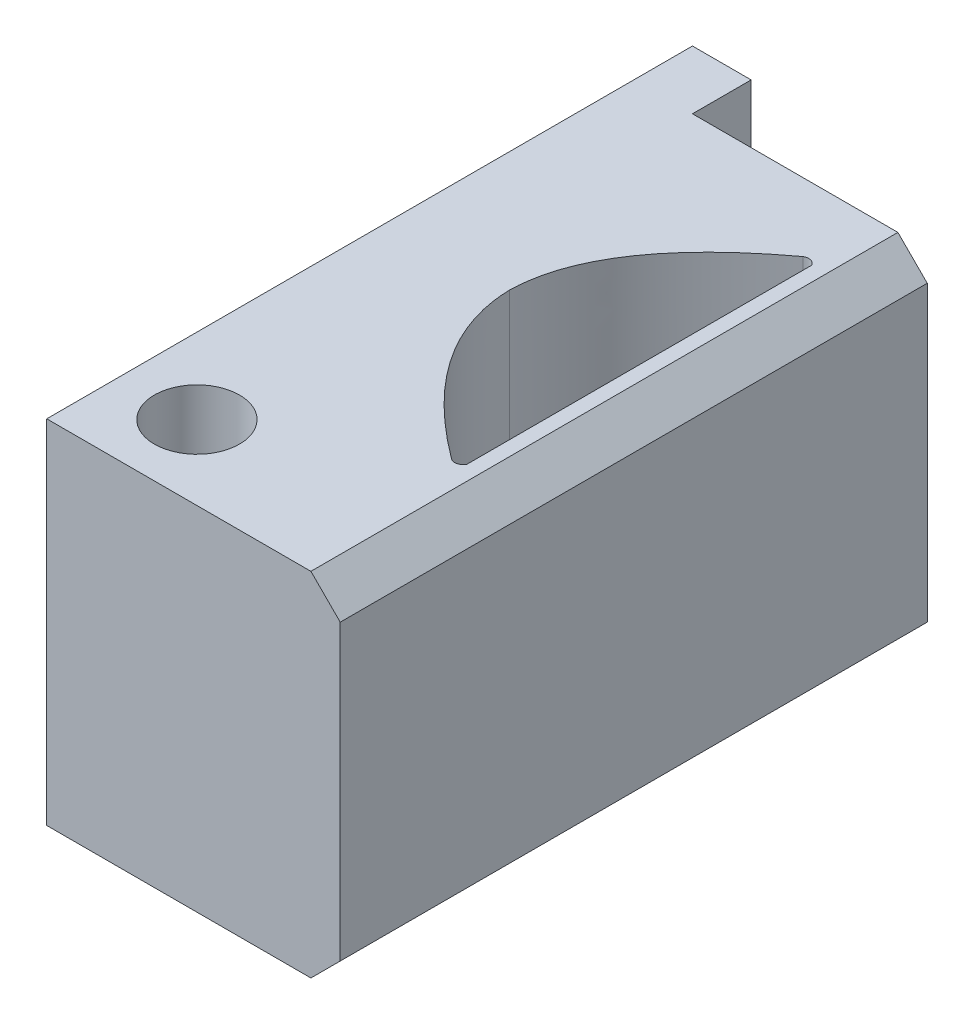
ISO-10303-21;
HEADER;
FILE_DESCRIPTION(('STEP AP214'),'2;1');
FILE_NAME('part.step','',(''),(''),'','','');
FILE_SCHEMA(('AUTOMOTIVE_DESIGN { 1 0 10303 214 1 1 1 1 }'));
ENDSEC;
DATA;
#1=APPLICATION_CONTEXT('core data for automotive mechanical design processes');
#2=APPLICATION_PROTOCOL_DEFINITION('international standard','automotive_design',2000,#1);
#3=PRODUCT_CONTEXT('',#1,'mechanical');
#4=PRODUCT('Part','Part','',(#3));
#5=PRODUCT_RELATED_PRODUCT_CATEGORY('part','',(#4));
#6=PRODUCT_DEFINITION_FORMATION('','',#4);
#7=PRODUCT_DEFINITION_CONTEXT('part definition',#1,'design');
#8=PRODUCT_DEFINITION('design','',#6,#7);
#9=PRODUCT_DEFINITION_SHAPE('','',#8);
#10=(LENGTH_UNIT() NAMED_UNIT(*) SI_UNIT(.MILLI.,.METRE.));
#11=(NAMED_UNIT(*) PLANE_ANGLE_UNIT() SI_UNIT($,.RADIAN.));
#12=(NAMED_UNIT(*) SI_UNIT($,.STERADIAN.) SOLID_ANGLE_UNIT());
#13=UNCERTAINTY_MEASURE_WITH_UNIT(LENGTH_MEASURE(1.E-05),#10,'distance_accuracy_value','');
#14=(GEOMETRIC_REPRESENTATION_CONTEXT(3) GLOBAL_UNCERTAINTY_ASSIGNED_CONTEXT((#13)) GLOBAL_UNIT_ASSIGNED_CONTEXT((#10,
#11,#12)) REPRESENTATION_CONTEXT('',''));
#15=CARTESIAN_POINT('',(0.,0.,0.));
#16=DIRECTION('',(0.,0.,1.));
#17=DIRECTION('',(1.,0.,0.));
#18=AXIS2_PLACEMENT_3D('',#15,#16,#17);
#19=CARTESIAN_POINT('',(-14.7422680412371,34.3606797749979,-11.9587628865979));
#20=DIRECTION('',(0.,0.,1.));
#21=DIRECTION('',(1.,0.,0.));
#22=AXIS2_PLACEMENT_3D('',#19,#20,#21);
#23=PLANE('',#22);
#24=DIRECTION('',(0.,-1.,0.));
#25=VECTOR('',#24,1.);
#26=CARTESIAN_POINT('',(-4.74226804123712,34.3606797749979,-11.9587628865979));
#27=LINE('',#26,#25);
#28=CARTESIAN_POINT('',(-4.74226804123712,11.,-11.9587628865979));
#29=VERTEX_POINT('',#28);
#30=CARTESIAN_POINT('',(-4.74226804123712,0.999999999999994,-11.9587628865979));
#31=VERTEX_POINT('',#30);
#32=EDGE_CURVE('E301',#29,#31,#27,.T.);
#33=ORIENTED_EDGE('',*,*,#32,.T.);
#34=DIRECTION('',(0.70710678118655,0.707106781186545,0.));
#35=VECTOR('',#34,1.);
#36=CARTESIAN_POINT('',(-4.74226804123712,0.999999999999994,-11.9587628865979));
#37=LINE('',#36,#35);
#38=CARTESIAN_POINT('',(-5.74226804123712,0.,-11.9587628865979));
#39=VERTEX_POINT('',#38);
#40=EDGE_CURVE('E262',#31,#39,#37,.F.);
#41=ORIENTED_EDGE('',*,*,#40,.T.);
#42=DIRECTION('',(-1.,0.,0.));
#43=VECTOR('',#42,1.);
#44=CARTESIAN_POINT('',(-14.7422680412371,0.,-11.9587628865979));
#45=LINE('',#44,#43);
#46=CARTESIAN_POINT('',(-12.7422680412371,0.,-11.9587628865979));
#47=VERTEX_POINT('',#46);
#48=EDGE_CURVE('E305',#39,#47,#45,.T.);
#49=ORIENTED_EDGE('',*,*,#48,.T.);
#50=DIRECTION('',(0.,-1.,0.));
#51=VECTOR('',#50,1.);
#52=CARTESIAN_POINT('',(-12.7422680412371,0.,-11.9587628865979));
#53=LINE('',#52,#51);
#54=CARTESIAN_POINT('',(-12.7422680412371,12.,-11.9587628865979));
#55=VERTEX_POINT('',#54);
#56=EDGE_CURVE('E170',#55,#47,#53,.T.);
#57=ORIENTED_EDGE('',*,*,#56,.F.);
#58=DIRECTION('',(-1.,0.,0.));
#59=VECTOR('',#58,1.);
#60=CARTESIAN_POINT('',(-14.7422680412371,12.,-11.9587628865979));
#61=LINE('',#60,#59);
#62=CARTESIAN_POINT('',(-5.74226804123712,12.,-11.9587628865979));
#63=VERTEX_POINT('',#62);
#64=EDGE_CURVE('E153',#63,#55,#61,.T.);
#65=ORIENTED_EDGE('',*,*,#64,.F.);
#66=DIRECTION('',(0.707106781186547,-0.707106781186548,0.));
#67=VECTOR('',#66,1.);
#68=CARTESIAN_POINT('',(-5.74226804123712,12.,-11.9587628865979));
#69=LINE('',#68,#67);
#70=EDGE_CURVE('E265',#63,#29,#69,.T.);
#71=ORIENTED_EDGE('',*,*,#70,.T.);
#72=EDGE_LOOP('',(#33,#41,#49,#57,#65,#71));
#73=FACE_BOUND('',#72,.T.);
#74=ADVANCED_FACE('F42',(#73),#23,.F.);
#75=CARTESIAN_POINT('',(-14.7422680412371,34.3606797749979,-11.9587628865979));
#76=DIRECTION('',(1.,0.,0.));
#77=DIRECTION('',(0.,0.,-1.));
#78=AXIS2_PLACEMENT_3D('',#75,#76,#77);
#79=PLANE('',#78);
#80=CARTESIAN_POINT('',(-14.7422680412371,6.,-6.91638582065934));
#81=DIRECTION('',(-1.,0.,0.));
#82=DIRECTION('',(0.,0.,1.));
#83=AXIS2_PLACEMENT_3D('',#80,#81,#82);
#84=CIRCLE('',#83,4.);
#85=CARTESIAN_POINT('',(-14.7422680412371,6.,-2.91638582065934));
#86=VERTEX_POINT('',#85);
#87=EDGE_CURVE('E186',#86,#86,#84,.T.);
#88=ORIENTED_EDGE('',*,*,#87,.F.);
#89=EDGE_LOOP('',(#88));
#90=FACE_BOUND('',#89,.T.);
#91=DIRECTION('',(0.,0.,1.));
#92=VECTOR('',#91,1.);
#93=CARTESIAN_POINT('',(-14.7422680412371,12.,-11.9587628865979));
#94=LINE('',#93,#92);
#95=CARTESIAN_POINT('',(-14.7422680412371,12.,-13.9587628865979));
#96=VERTEX_POINT('',#95);
#97=CARTESIAN_POINT('',(-14.7422680412371,12.,8.04123711340206));
#98=VERTEX_POINT('',#97);
#99=EDGE_CURVE('E143',#96,#98,#94,.T.);
#100=ORIENTED_EDGE('',*,*,#99,.F.);
#101=DIRECTION('',(0.,1.,0.));
#102=VECTOR('',#101,1.);
#103=CARTESIAN_POINT('',(-14.7422680412371,0.,-13.9587628865979));
#104=LINE('',#103,#102);
#105=CARTESIAN_POINT('',(-14.7422680412371,0.,-13.9587628865979));
#106=VERTEX_POINT('',#105);
#107=EDGE_CURVE('E148',#106,#96,#104,.T.);
#108=ORIENTED_EDGE('',*,*,#107,.F.);
#109=DIRECTION('',(0.,0.,1.));
#110=VECTOR('',#109,1.);
#111=CARTESIAN_POINT('',(-14.7422680412371,0.,-11.9587628865979));
#112=LINE('',#111,#110);
#113=CARTESIAN_POINT('',(-14.7422680412371,0.,8.04123711340206));
#114=VERTEX_POINT('',#113);
#115=EDGE_CURVE('E312',#106,#114,#112,.T.);
#116=ORIENTED_EDGE('',*,*,#115,.T.);
#117=DIRECTION('',(0.,-1.,0.));
#118=VECTOR('',#117,1.);
#119=CARTESIAN_POINT('',(-14.7422680412371,34.3606797749979,8.04123711340206));
#120=LINE('',#119,#118);
#121=EDGE_CURVE('E149',#98,#114,#120,.T.);
#122=ORIENTED_EDGE('',*,*,#121,.F.);
#123=EDGE_LOOP('',(#100,#108,#116,#122));
#124=FACE_BOUND('',#123,.T.);
#125=ADVANCED_FACE('F145',(#90,#124),#79,.F.);
#126=CARTESIAN_POINT('',(-14.7422680412371,34.3606797749979,8.04123711340206));
#127=DIRECTION('',(0.,0.,-1.));
#128=DIRECTION('',(-1.,0.,0.));
#129=AXIS2_PLACEMENT_3D('',#126,#127,#128);
#130=PLANE('',#129);
#131=DIRECTION('',(1.,0.,0.));
#132=VECTOR('',#131,1.);
#133=CARTESIAN_POINT('',(-14.7422680412371,0.,8.04123711340206));
#134=LINE('',#133,#132);
#135=CARTESIAN_POINT('',(-5.74226804123712,0.,8.04123711340206));
#136=VERTEX_POINT('',#135);
#137=EDGE_CURVE('E309',#114,#136,#134,.T.);
#138=ORIENTED_EDGE('',*,*,#137,.T.);
#139=DIRECTION('',(-0.70710678118655,-0.707106781186545,0.));
#140=VECTOR('',#139,1.);
#141=CARTESIAN_POINT('',(-4.74226804123712,0.999999999999993,8.04123711340206));
#142=LINE('',#141,#140);
#143=CARTESIAN_POINT('',(-4.74226804123712,0.999999999999994,8.04123711340206));
#144=VERTEX_POINT('',#143);
#145=EDGE_CURVE('E52',#136,#144,#142,.F.);
#146=ORIENTED_EDGE('',*,*,#145,.T.);
#147=DIRECTION('',(0.,-1.,0.));
#148=VECTOR('',#147,1.);
#149=CARTESIAN_POINT('',(-4.74226804123712,34.3606797749979,8.04123711340206));
#150=LINE('',#149,#148);
#151=CARTESIAN_POINT('',(-4.74226804123712,11.,8.04123711340206));
#152=VERTEX_POINT('',#151);
#153=EDGE_CURVE('E306',#152,#144,#150,.T.);
#154=ORIENTED_EDGE('',*,*,#153,.F.);
#155=DIRECTION('',(-0.707106781186547,0.707106781186548,0.));
#156=VECTOR('',#155,1.);
#157=CARTESIAN_POINT('',(-5.74226804123712,12.,8.04123711340206));
#158=LINE('',#157,#156);
#159=CARTESIAN_POINT('',(-5.74226804123712,12.,8.04123711340206));
#160=VERTEX_POINT('',#159);
#161=EDGE_CURVE('E59',#152,#160,#158,.T.);
#162=ORIENTED_EDGE('',*,*,#161,.T.);
#163=DIRECTION('',(1.,0.,0.));
#164=VECTOR('',#163,1.);
#165=CARTESIAN_POINT('',(-14.7422680412371,12.,8.04123711340206));
#166=LINE('',#165,#164);
#167=EDGE_CURVE('E152',#98,#160,#166,.T.);
#168=ORIENTED_EDGE('',*,*,#167,.F.);
#169=ORIENTED_EDGE('',*,*,#121,.T.);
#170=EDGE_LOOP('',(#138,#146,#154,#162,#168,#169));
#171=FACE_BOUND('',#170,.T.);
#172=ADVANCED_FACE('F229',(#171),#130,.F.);
#173=CARTESIAN_POINT('',(-4.74226804123712,34.3606797749979,-11.9587628865979));
#174=DIRECTION('',(-1.,0.,0.));
#175=DIRECTION('',(0.,0.,1.));
#176=AXIS2_PLACEMENT_3D('',#173,#174,#175);
#177=PLANE('',#176);
#178=ORIENTED_EDGE('',*,*,#153,.T.);
#179=DIRECTION('',(0.,0.,-1.));
#180=VECTOR('',#179,1.);
#181=CARTESIAN_POINT('',(-4.74226804123712,0.999999999999994,-11.9587628865979));
#182=LINE('',#181,#180);
#183=EDGE_CURVE('E254',#144,#31,#182,.T.);
#184=ORIENTED_EDGE('',*,*,#183,.T.);
#185=ORIENTED_EDGE('',*,*,#32,.F.);
#186=DIRECTION('',(0.,0.,1.));
#187=VECTOR('',#186,1.);
#188=CARTESIAN_POINT('',(-4.74226804123712,11.,8.04123711340206));
#189=LINE('',#188,#187);
#190=EDGE_CURVE('E270',#29,#152,#189,.T.);
#191=ORIENTED_EDGE('',*,*,#190,.T.);
#192=EDGE_LOOP('',(#178,#184,#185,#191));
#193=FACE_BOUND('',#192,.T.);
#194=ADVANCED_FACE('F222',(#193),#177,.F.);
#195=CARTESIAN_POINT('',(0.,0.,0.));
#196=DIRECTION('',(0.,1.,0.));
#197=DIRECTION('',(0.,0.,1.));
#198=AXIS2_PLACEMENT_3D('',#195,#196,#197);
#199=PLANE('',#198);
#200=CARTESIAN_POINT('',(-6.64249651910139,0.,-9.63291763967452));
#201=CARTESIAN_POINT('',(-9.19165467538477,0.,-7.74141466805063));
#202=CARTESIAN_POINT('',(-10.5727740481677,0.,-5.74651774065576));
#203=CARTESIAN_POINT('',(-10.6561058122395,0.,-3.7114147389487));
#204=CARTESIAN_POINT('',(-10.6574425104059,0.,-3.64424858904937));
#205=B_SPLINE_CURVE_WITH_KNOTS('',3,(#200,#201,#202,#203,#204),.UNSPECIFIED.,.F.,.F.,(4,1,4),
(0.0231952471273498,0.477185203536773,0.492669553963173),.UNSPECIFIED.);
#206=CARTESIAN_POINT('',(-6.64249651910139,0.,-9.63291763967452));
#207=VERTEX_POINT('',#206);
#208=CARTESIAN_POINT('',(-10.6574425104059,0.,-3.64424858904937));
#209=VERTEX_POINT('',#208);
#210=EDGE_CURVE('E191',#207,#209,#205,.T.);
#211=ORIENTED_EDGE('',*,*,#210,.T.);
#212=CARTESIAN_POINT('',(-6.64249651910139,0.,2.34442046157578));
#213=CARTESIAN_POINT('',(-9.19165467538477,0.,0.452917489951885));
#214=CARTESIAN_POINT('',(-10.5727740481677,0.,-1.54197943744297));
#215=CARTESIAN_POINT('',(-10.6561058122395,0.,-3.57708243915004));
#216=CARTESIAN_POINT('',(-10.6574425104059,0.,-3.64424858904937));
#217=B_SPLINE_CURVE_WITH_KNOTS('',3,(#212,#213,#214,#215,#216),.UNSPECIFIED.,.F.,.F.,(4,1,4),
(0.0231952471273498,0.477185203536773,0.492669553963173),.UNSPECIFIED.);
#218=CARTESIAN_POINT('',(-6.64249651910139,0.,2.34442046157578));
#219=VERTEX_POINT('',#218);
#220=EDGE_CURVE('E337',#219,#209,#217,.T.);
#221=ORIENTED_EDGE('',*,*,#220,.F.);
#222=CARTESIAN_POINT('',(-6.49793326874127,0.,2.09130009743134));
#223=DIRECTION('',(0.,-1.,0.));
#224=DIRECTION('',(0.,0.,-1.));
#225=AXIS2_PLACEMENT_3D('',#222,#223,#224);
#226=CIRCLE('',#225,0.291493485517758);
#227=CARTESIAN_POINT('',(-6.24226804123712,0.,2.23131346659494));
#228=VERTEX_POINT('',#227);
#229=EDGE_CURVE('E353',#228,#219,#226,.T.);
#230=ORIENTED_EDGE('',*,*,#229,.F.);
#231=DIRECTION('',(0.,0.,-1.));
#232=VECTOR('',#231,1.);
#233=CARTESIAN_POINT('',(-6.24226804123712,0.,0.));
#234=LINE('',#233,#232);
#235=CARTESIAN_POINT('',(-6.24226804123712,0.,-9.51981064469369));
#236=VERTEX_POINT('',#235);
#237=EDGE_CURVE('E360',#228,#236,#234,.T.);
#238=ORIENTED_EDGE('',*,*,#237,.T.);
#239=CARTESIAN_POINT('',(-6.49793326874127,0.,-9.37979727553009));
#240=DIRECTION('',(0.,-1.,0.));
#241=DIRECTION('',(0.,0.,-1.));
#242=AXIS2_PLACEMENT_3D('',#239,#240,#241);
#243=CIRCLE('',#242,0.291493485517757);
#244=EDGE_CURVE('E364',#236,#207,#243,.F.);
#245=ORIENTED_EDGE('',*,*,#244,.T.);
#246=EDGE_LOOP('',(#211,#221,#230,#238,#245));
#247=FACE_BOUND('',#246,.T.);
#248=CARTESIAN_POINT('',(-12.1613645588025,0.,5.50537782780894));
#249=DIRECTION('',(0.,1.,0.));
#250=DIRECTION('',(0.,0.,1.));
#251=AXIS2_PLACEMENT_3D('',#248,#249,#250);
#252=CIRCLE('',#251,1.45);
#253=CARTESIAN_POINT('',(-12.1613645588025,0.,6.95537782780894));
#254=VERTEX_POINT('',#253);
#255=EDGE_CURVE('E319',#254,#254,#252,.T.);
#256=ORIENTED_EDGE('',*,*,#255,.T.);
#257=EDGE_LOOP('',(#256));
#258=FACE_BOUND('',#257,.T.);
#259=ORIENTED_EDGE('',*,*,#48,.F.);
#260=DIRECTION('',(0.,0.,1.));
#261=VECTOR('',#260,1.);
#262=CARTESIAN_POINT('',(-5.74226804123712,0.,0.));
#263=LINE('',#262,#261);
#264=EDGE_CURVE('E67',#39,#136,#263,.T.);
#265=ORIENTED_EDGE('',*,*,#264,.T.);
#266=ORIENTED_EDGE('',*,*,#137,.F.);
#267=ORIENTED_EDGE('',*,*,#115,.F.);
#268=DIRECTION('',(-1.,0.,0.));
#269=VECTOR('',#268,1.);
#270=CARTESIAN_POINT('',(-14.7422680412371,0.,-13.9587628865979));
#271=LINE('',#270,#269);
#272=CARTESIAN_POINT('',(-12.7422680412371,0.,-13.9587628865979));
#273=VERTEX_POINT('',#272);
#274=EDGE_CURVE('E168',#273,#106,#271,.T.);
#275=ORIENTED_EDGE('',*,*,#274,.F.);
#276=DIRECTION('',(0.,0.,1.));
#277=VECTOR('',#276,1.);
#278=CARTESIAN_POINT('',(-12.7422680412371,0.,-13.9587628865979));
#279=LINE('',#278,#277);
#280=EDGE_CURVE('E179',#273,#47,#279,.T.);
#281=ORIENTED_EDGE('',*,*,#280,.T.);
#282=EDGE_LOOP('',(#259,#265,#266,#267,#275,#281));
#283=FACE_BOUND('',#282,.T.);
#284=ADVANCED_FACE('F219',(#247,#258,#283),#199,.F.);
#285=CARTESIAN_POINT('',(-22.803237227535,12.,6.34046901371173));
#286=DIRECTION('',(0.,1.,0.));
#287=DIRECTION('',(0.,0.,1.));
#288=AXIS2_PLACEMENT_3D('',#285,#286,#287);
#289=PLANE('',#288);
#290=CARTESIAN_POINT('',(-6.64249651910139,12.,2.34442046157578));
#291=CARTESIAN_POINT('',(-9.19165467538477,12.,0.452917489951885));
#292=CARTESIAN_POINT('',(-10.5727740481677,12.,-1.54197943744297));
#293=CARTESIAN_POINT('',(-10.6561058122395,12.,-3.57708243915004));
#294=CARTESIAN_POINT('',(-10.6574425104059,12.,-3.64424858904937));
#295=B_SPLINE_CURVE_WITH_KNOTS('',3,(#290,#291,#292,#293,#294),.UNSPECIFIED.,.F.,.F.,(4,1,4),
(0.0231952471273498,0.477185203536773,0.492669553963173),.UNSPECIFIED.);
#296=CARTESIAN_POINT('',(-10.6574425104059,12.,-3.64424858904937));
#297=VERTEX_POINT('',#296);
#298=CARTESIAN_POINT('',(-6.64249651910139,12.,2.34442046157578));
#299=VERTEX_POINT('',#298);
#300=EDGE_CURVE('E279',#297,#299,#295,.F.);
#301=ORIENTED_EDGE('',*,*,#300,.F.);
#302=CARTESIAN_POINT('',(-6.64249651910139,12.,-9.63291763967452));
#303=CARTESIAN_POINT('',(-9.19165467538477,12.,-7.74141466805063));
#304=CARTESIAN_POINT('',(-10.5727740481677,12.,-5.74651774065576));
#305=CARTESIAN_POINT('',(-10.6561058122395,12.,-3.7114147389487));
#306=CARTESIAN_POINT('',(-10.6574425104059,12.,-3.64424858904937));
#307=B_SPLINE_CURVE_WITH_KNOTS('',3,(#302,#303,#304,#305,#306),.UNSPECIFIED.,.F.,.F.,(4,1,4),
(0.0231952471273498,0.477185203536773,0.492669553963173),.UNSPECIFIED.);
#308=CARTESIAN_POINT('',(-6.64249651910139,12.,-9.63291763967452));
#309=VERTEX_POINT('',#308);
#310=EDGE_CURVE('E273',#297,#309,#307,.F.);
#311=ORIENTED_EDGE('',*,*,#310,.T.);
#312=CARTESIAN_POINT('',(-6.49793326874127,12.,-9.37979727553009));
#313=DIRECTION('',(0.,1.,0.));
#314=DIRECTION('',(0.,0.,1.));
#315=AXIS2_PLACEMENT_3D('',#312,#313,#314);
#316=CIRCLE('',#315,0.291493485517757);
#317=CARTESIAN_POINT('',(-6.24226804123712,12.,-9.51981064469369));
#318=VERTEX_POINT('',#317);
#319=EDGE_CURVE('E297',#309,#318,#316,.F.);
#320=ORIENTED_EDGE('',*,*,#319,.T.);
#321=DIRECTION('',(0.,0.,1.));
#322=VECTOR('',#321,1.);
#323=CARTESIAN_POINT('',(-6.24226804123712,12.,6.34046901371173));
#324=LINE('',#323,#322);
#325=CARTESIAN_POINT('',(-6.24226804123712,12.,2.23131346659494));
#326=VERTEX_POINT('',#325);
#327=EDGE_CURVE('E293',#318,#326,#324,.T.);
#328=ORIENTED_EDGE('',*,*,#327,.T.);
#329=CARTESIAN_POINT('',(-6.49793326874127,12.,2.09130009743134));
#330=DIRECTION('',(0.,1.,0.));
#331=DIRECTION('',(0.,0.,1.));
#332=AXIS2_PLACEMENT_3D('',#329,#330,#331);
#333=CIRCLE('',#332,0.291493485517758);
#334=EDGE_CURVE('E287',#299,#326,#333,.T.);
#335=ORIENTED_EDGE('',*,*,#334,.F.);
#336=EDGE_LOOP('',(#301,#311,#320,#328,#335));
#337=FACE_BOUND('',#336,.T.);
#338=CARTESIAN_POINT('',(-12.1613645588025,12.,5.50537782780894));
#339=DIRECTION('',(0.,1.,0.));
#340=DIRECTION('',(0.,0.,1.));
#341=AXIS2_PLACEMENT_3D('',#338,#339,#340);
#342=CIRCLE('',#341,1.45);
#343=CARTESIAN_POINT('',(-12.1613645588025,12.,6.95537782780894));
#344=VERTEX_POINT('',#343);
#345=EDGE_CURVE('E327',#344,#344,#342,.T.);
#346=ORIENTED_EDGE('',*,*,#345,.F.);
#347=EDGE_LOOP('',(#346));
#348=FACE_BOUND('',#347,.T.);
#349=ORIENTED_EDGE('',*,*,#167,.T.);
#350=DIRECTION('',(0.,0.,-1.));
#351=VECTOR('',#350,1.);
#352=CARTESIAN_POINT('',(-5.74226804123712,12.,-11.9587628865979));
#353=LINE('',#352,#351);
#354=EDGE_CURVE('E11',#160,#63,#353,.T.);
#355=ORIENTED_EDGE('',*,*,#354,.T.);
#356=ORIENTED_EDGE('',*,*,#64,.T.);
#357=DIRECTION('',(0.,0.,1.));
#358=VECTOR('',#357,1.);
#359=CARTESIAN_POINT('',(-12.7422680412371,12.,-13.9587628865979));
#360=LINE('',#359,#358);
#361=CARTESIAN_POINT('',(-12.7422680412371,12.,-13.9587628865979));
#362=VERTEX_POINT('',#361);
#363=EDGE_CURVE('E159',#362,#55,#360,.T.);
#364=ORIENTED_EDGE('',*,*,#363,.F.);
#365=DIRECTION('',(1.,0.,0.));
#366=VECTOR('',#365,1.);
#367=CARTESIAN_POINT('',(-14.7422680412371,12.,-13.9587628865979));
#368=LINE('',#367,#366);
#369=EDGE_CURVE('E156',#96,#362,#368,.T.);
#370=ORIENTED_EDGE('',*,*,#369,.F.);
#371=ORIENTED_EDGE('',*,*,#99,.T.);
#372=EDGE_LOOP('',(#349,#355,#356,#364,#370,#371));
#373=FACE_BOUND('',#372,.T.);
#374=ADVANCED_FACE('F157',(#337,#348,#373),#289,.T.);
#375=CARTESIAN_POINT('',(-12.1613645588025,-10.,5.50537782780894));
#376=DIRECTION('',(0.,1.,0.));
#377=DIRECTION('',(0.,0.,1.));
#378=AXIS2_PLACEMENT_3D('',#375,#376,#377);
#379=CYLINDRICAL_SURFACE('',#378,1.45);
#380=ORIENTED_EDGE('',*,*,#345,.T.);
#381=EDGE_LOOP('',(#380));
#382=FACE_BOUND('',#381,.T.);
#383=ORIENTED_EDGE('',*,*,#255,.F.);
#384=EDGE_LOOP('',(#383));
#385=FACE_BOUND('',#384,.T.);
#386=ADVANCED_FACE('F212',(#382,#385),#379,.F.);
#387=CARTESIAN_POINT('',(-6.64249651910139,34.,-9.63291763967452));
#388=CARTESIAN_POINT('',(-9.19165467538477,34.,-7.74141466805063));
#389=CARTESIAN_POINT('',(-10.5727740481677,34.,-5.74651774065576));
#390=CARTESIAN_POINT('',(-10.6561058122395,34.,-3.7114147389487));
#391=CARTESIAN_POINT('',(-10.6574425104059,34.,-3.64424858904937));
#392=B_SPLINE_CURVE_WITH_KNOTS('',3,(#387,#388,#389,#390,#391),.UNSPECIFIED.,.F.,.F.,(4,1,4),
(0.0231952471273498,0.477185203536773,0.492669553963173),.UNSPECIFIED.);
#393=DIRECTION('',(0.,-1.,0.));
#394=VECTOR('',#393,1.);
#395=SURFACE_OF_LINEAR_EXTRUSION('',#392,#394);
#396=DIRECTION('',(0.,-1.,0.));
#397=VECTOR('',#396,1.);
#398=CARTESIAN_POINT('',(-10.6574425104059,34.,-3.64424858904937));
#399=LINE('',#398,#397);
#400=EDGE_CURVE('E331',#297,#209,#399,.T.);
#401=ORIENTED_EDGE('',*,*,#400,.T.);
#402=ORIENTED_EDGE('',*,*,#210,.F.);
#403=DIRECTION('',(0.,-1.,0.));
#404=VECTOR('',#403,1.);
#405=CARTESIAN_POINT('',(-6.64249651910139,34.,-9.63291763967452));
#406=LINE('',#405,#404);
#407=EDGE_CURVE('E332',#309,#207,#406,.T.);
#408=ORIENTED_EDGE('',*,*,#407,.F.);
#409=ORIENTED_EDGE('',*,*,#310,.F.);
#410=EDGE_LOOP('',(#401,#402,#408,#409));
#411=FACE_BOUND('',#410,.T.);
#412=ADVANCED_FACE('F207',(#411),#395,.T.);
#413=CARTESIAN_POINT('',(-6.64249651910139,34.,2.34442046157578));
#414=CARTESIAN_POINT('',(-9.19165467538477,34.,0.452917489951885));
#415=CARTESIAN_POINT('',(-10.5727740481677,34.,-1.54197943744297));
#416=CARTESIAN_POINT('',(-10.6561058122395,34.,-3.57708243915004));
#417=CARTESIAN_POINT('',(-10.6574425104059,34.,-3.64424858904937));
#418=B_SPLINE_CURVE_WITH_KNOTS('',3,(#413,#414,#415,#416,#417),.UNSPECIFIED.,.F.,.F.,(4,1,4),
(0.0231952471273498,0.477185203536773,0.492669553963173),.UNSPECIFIED.);
#419=DIRECTION('',(0.,-1.,0.));
#420=VECTOR('',#419,1.);
#421=SURFACE_OF_LINEAR_EXTRUSION('',#418,#420);
#422=ORIENTED_EDGE('',*,*,#300,.T.);
#423=DIRECTION('',(0.,-1.,0.));
#424=VECTOR('',#423,1.);
#425=CARTESIAN_POINT('',(-6.64249651910139,34.,2.34442046157578));
#426=LINE('',#425,#424);
#427=EDGE_CURVE('E343',#299,#219,#426,.T.);
#428=ORIENTED_EDGE('',*,*,#427,.T.);
#429=ORIENTED_EDGE('',*,*,#220,.T.);
#430=ORIENTED_EDGE('',*,*,#400,.F.);
#431=EDGE_LOOP('',(#422,#428,#429,#430));
#432=FACE_BOUND('',#431,.T.);
#433=ADVANCED_FACE('F211',(#432),#421,.F.);
#434=CARTESIAN_POINT('',(-6.49793326874127,34.,2.09130009743134));
#435=DIRECTION('',(0.,-1.,0.));
#436=DIRECTION('',(0.,0.,-1.));
#437=AXIS2_PLACEMENT_3D('',#434,#435,#436);
#438=CYLINDRICAL_SURFACE('',#437,0.291493485517758);
#439=ORIENTED_EDGE('',*,*,#334,.T.);
#440=DIRECTION('',(0.,-1.,0.));
#441=VECTOR('',#440,1.);
#442=CARTESIAN_POINT('',(-6.24226804123712,34.,2.23131346659494));
#443=LINE('',#442,#441);
#444=EDGE_CURVE('E340',#326,#228,#443,.T.);
#445=ORIENTED_EDGE('',*,*,#444,.T.);
#446=ORIENTED_EDGE('',*,*,#229,.T.);
#447=ORIENTED_EDGE('',*,*,#427,.F.);
#448=EDGE_LOOP('',(#439,#445,#446,#447));
#449=FACE_BOUND('',#448,.T.);
#450=ADVANCED_FACE('F388',(#449),#438,.F.);
#451=CARTESIAN_POINT('',(-6.24226804123712,34.,0.));
#452=DIRECTION('',(-1.,0.,0.));
#453=DIRECTION('',(0.,0.,1.));
#454=AXIS2_PLACEMENT_3D('',#451,#452,#453);
#455=PLANE('',#454);
#456=DIRECTION('',(0.,-1.,0.));
#457=VECTOR('',#456,1.);
#458=CARTESIAN_POINT('',(-6.24226804123712,34.,-9.51981064469369));
#459=LINE('',#458,#457);
#460=EDGE_CURVE('E336',#318,#236,#459,.T.);
#461=ORIENTED_EDGE('',*,*,#460,.T.);
#462=ORIENTED_EDGE('',*,*,#237,.F.);
#463=ORIENTED_EDGE('',*,*,#444,.F.);
#464=ORIENTED_EDGE('',*,*,#327,.F.);
#465=EDGE_LOOP('',(#461,#462,#463,#464));
#466=FACE_BOUND('',#465,.T.);
#467=ADVANCED_FACE('F392',(#466),#455,.T.);
#468=CARTESIAN_POINT('',(-6.49793326874127,34.,-9.37979727553009));
#469=DIRECTION('',(0.,-1.,0.));
#470=DIRECTION('',(0.,0.,-1.));
#471=AXIS2_PLACEMENT_3D('',#468,#469,#470);
#472=CYLINDRICAL_SURFACE('',#471,0.291493485517757);
#473=ORIENTED_EDGE('',*,*,#407,.T.);
#474=ORIENTED_EDGE('',*,*,#244,.F.);
#475=ORIENTED_EDGE('',*,*,#460,.F.);
#476=ORIENTED_EDGE('',*,*,#319,.F.);
#477=EDGE_LOOP('',(#473,#474,#475,#476));
#478=FACE_BOUND('',#477,.T.);
#479=ADVANCED_FACE('F214',(#478),#472,.F.);
#480=CARTESIAN_POINT('',(-12.7422680412371,6.,-6.91638582065934));
#481=DIRECTION('',(-1.,0.,0.));
#482=DIRECTION('',(0.,0.,1.));
#483=AXIS2_PLACEMENT_3D('',#480,#481,#482);
#484=CYLINDRICAL_SURFACE('',#483,4.);
#485=CARTESIAN_POINT('',(-12.7422680412371,6.,-6.91638582065934));
#486=DIRECTION('',(-1.,0.,0.));
#487=DIRECTION('',(0.,0.,1.));
#488=AXIS2_PLACEMENT_3D('',#485,#486,#487);
#489=CIRCLE('',#488,4.);
#490=CARTESIAN_POINT('',(-12.7422680412371,6.,-2.91638582065934));
#491=VERTEX_POINT('',#490);
#492=EDGE_CURVE('E187',#491,#491,#489,.T.);
#493=ORIENTED_EDGE('',*,*,#492,.F.);
#494=EDGE_LOOP('',(#493));
#495=FACE_BOUND('',#494,.T.);
#496=ORIENTED_EDGE('',*,*,#87,.T.);
#497=EDGE_LOOP('',(#496));
#498=FACE_BOUND('',#497,.T.);
#499=ADVANCED_FACE('F398',(#495,#498),#484,.F.);
#500=CARTESIAN_POINT('',(-12.7422680412371,6.,-6.91638582065934));
#501=DIRECTION('',(-1.,0.,0.));
#502=DIRECTION('',(0.,0.,1.));
#503=AXIS2_PLACEMENT_3D('',#500,#501,#502);
#504=PLANE('',#503);
#505=ORIENTED_EDGE('',*,*,#492,.T.);
#506=EDGE_LOOP('',(#505));
#507=FACE_BOUND('',#506,.T.);
#508=ADVANCED_FACE('F405',(#507),#504,.T.);
#509=CARTESIAN_POINT('',(-12.7422680412371,0.,-13.9587628865979));
#510=DIRECTION('',(-1.,0.,0.));
#511=DIRECTION('',(0.,0.,1.));
#512=AXIS2_PLACEMENT_3D('',#509,#510,#511);
#513=PLANE('',#512);
#514=ORIENTED_EDGE('',*,*,#56,.T.);
#515=ORIENTED_EDGE('',*,*,#280,.F.);
#516=DIRECTION('',(0.,-1.,0.));
#517=VECTOR('',#516,1.);
#518=CARTESIAN_POINT('',(-12.7422680412371,0.,-13.9587628865979));
#519=LINE('',#518,#517);
#520=EDGE_CURVE('E163',#362,#273,#519,.T.);
#521=ORIENTED_EDGE('',*,*,#520,.F.);
#522=ORIENTED_EDGE('',*,*,#363,.T.);
#523=EDGE_LOOP('',(#514,#515,#521,#522));
#524=FACE_BOUND('',#523,.T.);
#525=ADVANCED_FACE('F249',(#524),#513,.F.);
#526=CARTESIAN_POINT('',(0.,0.,-13.9587628865979));
#527=DIRECTION('',(0.,0.,-1.));
#528=DIRECTION('',(-1.,0.,0.));
#529=AXIS2_PLACEMENT_3D('',#526,#527,#528);
#530=PLANE('',#529);
#531=ORIENTED_EDGE('',*,*,#107,.T.);
#532=ORIENTED_EDGE('',*,*,#369,.T.);
#533=ORIENTED_EDGE('',*,*,#520,.T.);
#534=ORIENTED_EDGE('',*,*,#274,.T.);
#535=EDGE_LOOP('',(#531,#532,#533,#534));
#536=FACE_BOUND('',#535,.T.);
#537=ADVANCED_FACE('F166',(#536),#530,.T.);
#538=CARTESIAN_POINT('',(-4.74226804123712,0.999999999999994,-11.9587628865979));
#539=DIRECTION('',(-0.707106781186545,0.70710678118655,0.));
#540=DIRECTION('',(0.,0.,-1.));
#541=AXIS2_PLACEMENT_3D('',#538,#539,#540);
#542=PLANE('',#541);
#543=ORIENTED_EDGE('',*,*,#145,.F.);
#544=ORIENTED_EDGE('',*,*,#264,.F.);
#545=ORIENTED_EDGE('',*,*,#40,.F.);
#546=ORIENTED_EDGE('',*,*,#183,.F.);
#547=EDGE_LOOP('',(#543,#544,#545,#546));
#548=FACE_BOUND('',#547,.T.);
#549=ADVANCED_FACE('F239',(#548),#542,.F.);
#550=CARTESIAN_POINT('',(-5.74226804123712,12.,6.34046901371173));
#551=DIRECTION('',(0.707106781186548,0.707106781186547,0.));
#552=DIRECTION('',(0.,0.,1.));
#553=AXIS2_PLACEMENT_3D('',#550,#551,#552);
#554=PLANE('',#553);
#555=ORIENTED_EDGE('',*,*,#161,.F.);
#556=ORIENTED_EDGE('',*,*,#190,.F.);
#557=ORIENTED_EDGE('',*,*,#70,.F.);
#558=ORIENTED_EDGE('',*,*,#354,.F.);
#559=EDGE_LOOP('',(#555,#556,#557,#558));
#560=FACE_BOUND('',#559,.T.);
#561=ADVANCED_FACE('F45',(#560),#554,.T.);
#562=CLOSED_SHELL('',(#74,#125,#172,#194,#284,#374,#386,#412,#433,#450,#467,#479,#499,#508,#525,
#537,#549,#561));
#563=MANIFOLD_SOLID_BREP('B2',#562);
#564=ADVANCED_BREP_SHAPE_REPRESENTATION('',(#18,#563),#14);
#565=SHAPE_DEFINITION_REPRESENTATION(#9,#564);
ENDSEC;
END-ISO-10303-21;
